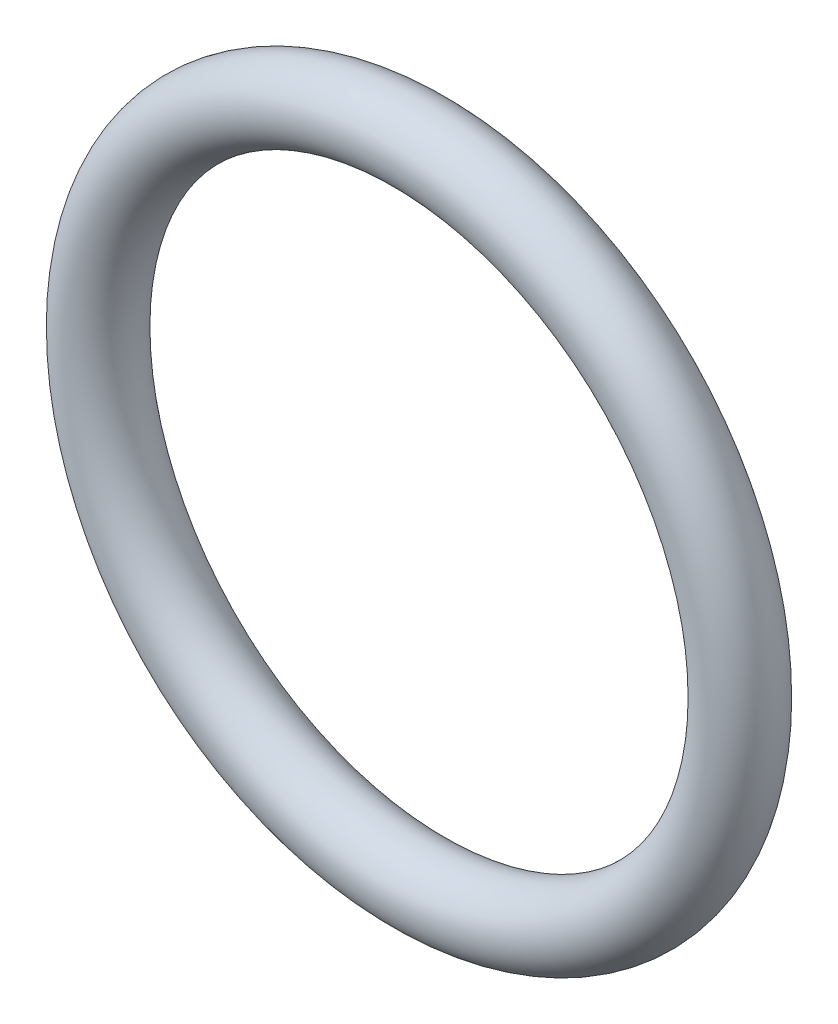
ISO-10303-21;
HEADER;
FILE_DESCRIPTION(('STEP AP214'),'2;1');
FILE_NAME('part.step','',(''),(''),'','','');
FILE_SCHEMA(('AUTOMOTIVE_DESIGN { 1 0 10303 214 1 1 1 1 }'));
ENDSEC;
DATA;
#1=APPLICATION_CONTEXT('core data for automotive mechanical design processes');
#2=APPLICATION_PROTOCOL_DEFINITION('international standard','automotive_design',2000,#1);
#3=PRODUCT_CONTEXT('',#1,'mechanical');
#4=PRODUCT('Part','Part','',(#3));
#5=PRODUCT_RELATED_PRODUCT_CATEGORY('part','',(#4));
#6=PRODUCT_DEFINITION_FORMATION('','',#4);
#7=PRODUCT_DEFINITION_CONTEXT('part definition',#1,'design');
#8=PRODUCT_DEFINITION('design','',#6,#7);
#9=PRODUCT_DEFINITION_SHAPE('','',#8);
#10=(LENGTH_UNIT() NAMED_UNIT(*) SI_UNIT(.MILLI.,.METRE.));
#11=(NAMED_UNIT(*) PLANE_ANGLE_UNIT() SI_UNIT($,.RADIAN.));
#12=(NAMED_UNIT(*) SI_UNIT($,.STERADIAN.) SOLID_ANGLE_UNIT());
#13=UNCERTAINTY_MEASURE_WITH_UNIT(LENGTH_MEASURE(1.E-05),#10,'distance_accuracy_value','');
#14=(GEOMETRIC_REPRESENTATION_CONTEXT(3) GLOBAL_UNCERTAINTY_ASSIGNED_CONTEXT((#13)) GLOBAL_UNIT_ASSIGNED_CONTEXT((#10,
#11,#12)) REPRESENTATION_CONTEXT('',''));
#15=CARTESIAN_POINT('',(0.,0.,0.));
#16=DIRECTION('',(0.,0.,1.));
#17=DIRECTION('',(1.,0.,0.));
#18=AXIS2_PLACEMENT_3D('',#15,#16,#17);
#19=CARTESIAN_POINT('',(0.,0.,0.));
#20=DIRECTION('',(0.,0.,1.));
#21=DIRECTION('',(1.,0.,0.));
#22=AXIS2_PLACEMENT_3D('',#19,#20,#21);
#23=TOROIDAL_SURFACE('',#22,11.4554,1.3081);
#24=CARTESIAN_POINT('',(12.7635,0.,0.));
#25=VERTEX_POINT('',#24);
#26=VERTEX_LOOP('',#25);
#27=FACE_BOUND('',#26,.T.);
#28=ADVANCED_FACE('F43',(#27),#23,.T.);
#29=CLOSED_SHELL('',(#28));
#30=MANIFOLD_SOLID_BREP('B2',#29);
#31=ADVANCED_BREP_SHAPE_REPRESENTATION('',(#18,#30),#14);
#32=SHAPE_DEFINITION_REPRESENTATION(#9,#31);
ENDSEC;
END-ISO-10303-21;
